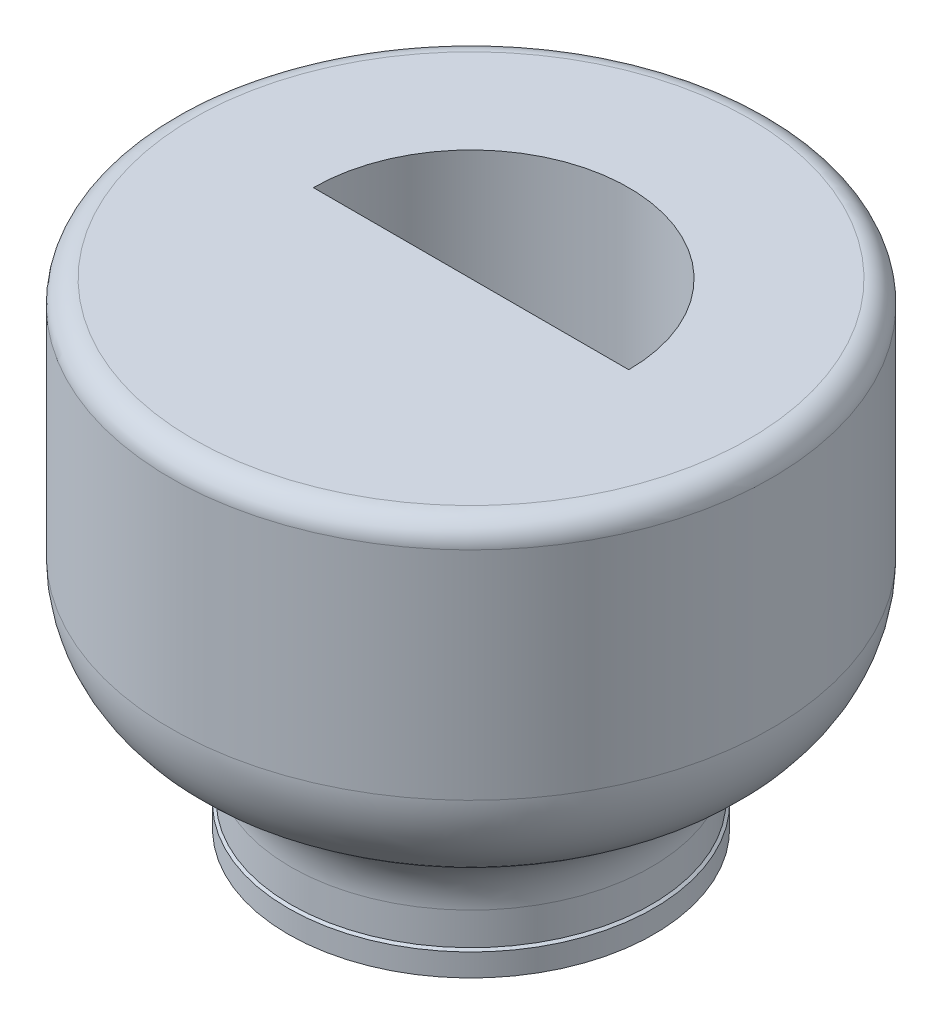
ISO-10303-21;
HEADER;
FILE_DESCRIPTION(('STEP AP214'),'2;1');
FILE_NAME('part.step','',(''),(''),'','','');
FILE_SCHEMA(('AUTOMOTIVE_DESIGN { 1 0 10303 214 1 1 1 1 }'));
ENDSEC;
DATA;
#1=APPLICATION_CONTEXT('core data for automotive mechanical design processes');
#2=APPLICATION_PROTOCOL_DEFINITION('international standard','automotive_design',2000,#1);
#3=PRODUCT_CONTEXT('',#1,'mechanical');
#4=PRODUCT('Part','Part','',(#3));
#5=PRODUCT_RELATED_PRODUCT_CATEGORY('part','',(#4));
#6=PRODUCT_DEFINITION_FORMATION('','',#4);
#7=PRODUCT_DEFINITION_CONTEXT('part definition',#1,'design');
#8=PRODUCT_DEFINITION('design','',#6,#7);
#9=PRODUCT_DEFINITION_SHAPE('','',#8);
#10=(LENGTH_UNIT() NAMED_UNIT(*) SI_UNIT(.MILLI.,.METRE.));
#11=(NAMED_UNIT(*) PLANE_ANGLE_UNIT() SI_UNIT($,.RADIAN.));
#12=(NAMED_UNIT(*) SI_UNIT($,.STERADIAN.) SOLID_ANGLE_UNIT());
#13=UNCERTAINTY_MEASURE_WITH_UNIT(LENGTH_MEASURE(1.E-05),#10,'distance_accuracy_value','');
#14=(GEOMETRIC_REPRESENTATION_CONTEXT(3) GLOBAL_UNCERTAINTY_ASSIGNED_CONTEXT((#13)) GLOBAL_UNIT_ASSIGNED_CONTEXT((#10,
#11,#12)) REPRESENTATION_CONTEXT('',''));
#15=CARTESIAN_POINT('',(0.,0.,0.));
#16=DIRECTION('',(0.,0.,1.));
#17=DIRECTION('',(1.,0.,0.));
#18=AXIS2_PLACEMENT_3D('',#15,#16,#17);
#19=CARTESIAN_POINT('',(0.,0.,0.));
#20=DIRECTION('',(0.,-1.,0.));
#21=DIRECTION('',(0.,0.,-1.));
#22=AXIS2_PLACEMENT_3D('',#19,#20,#21);
#23=CYLINDRICAL_SURFACE('',#22,22.5);
#24=CARTESIAN_POINT('',(0.,0.,0.));
#25=DIRECTION('',(0.,-1.,0.));
#26=DIRECTION('',(0.,0.,-1.));
#27=AXIS2_PLACEMENT_3D('',#24,#25,#26);
#28=CIRCLE('',#27,22.5);
#29=CARTESIAN_POINT('',(0.,0.,-22.5));
#30=VERTEX_POINT('',#29);
#31=EDGE_CURVE('E64',#30,#30,#28,.T.);
#32=ORIENTED_EDGE('',*,*,#31,.T.);
#33=EDGE_LOOP('',(#32));
#34=FACE_BOUND('',#33,.T.);
#35=CARTESIAN_POINT('',(0.,12.5,0.));
#36=DIRECTION('',(0.,-1.,0.));
#37=DIRECTION('',(0.,0.,-1.));
#38=AXIS2_PLACEMENT_3D('',#35,#36,#37);
#39=CIRCLE('',#38,22.5);
#40=CARTESIAN_POINT('',(0.,12.5,-22.5));
#41=VERTEX_POINT('',#40);
#42=EDGE_CURVE('E109',#41,#41,#39,.T.);
#43=ORIENTED_EDGE('',*,*,#42,.F.);
#44=EDGE_LOOP('',(#43));
#45=FACE_BOUND('',#44,.T.);
#46=ADVANCED_FACE('F36',(#34,#45),#23,.F.);
#47=CARTESIAN_POINT('',(0.,12.5,0.));
#48=DIRECTION('',(0.,-1.,0.));
#49=DIRECTION('',(0.,0.,-1.));
#50=AXIS2_PLACEMENT_3D('',#47,#48,#49);
#51=TOROIDAL_SURFACE('',#50,22.,0.5);
#52=ORIENTED_EDGE('',*,*,#42,.T.);
#53=EDGE_LOOP('',(#52));
#54=FACE_BOUND('',#53,.T.);
#55=CARTESIAN_POINT('',(0.,13.,0.));
#56=DIRECTION('',(0.,-1.,0.));
#57=DIRECTION('',(0.,0.,-1.));
#58=AXIS2_PLACEMENT_3D('',#55,#56,#57);
#59=CIRCLE('',#58,22.);
#60=CARTESIAN_POINT('',(0.,13.,-22.));
#61=VERTEX_POINT('',#60);
#62=EDGE_CURVE('E106',#61,#61,#59,.T.);
#63=ORIENTED_EDGE('',*,*,#62,.F.);
#64=EDGE_LOOP('',(#63));
#65=FACE_BOUND('',#64,.T.);
#66=ADVANCED_FACE('F174',(#54,#65),#51,.F.);
#67=CARTESIAN_POINT('',(0.,13.,0.));
#68=DIRECTION('',(0.,-1.,0.));
#69=DIRECTION('',(0.,0.,-1.));
#70=AXIS2_PLACEMENT_3D('',#67,#68,#69);
#71=PLANE('',#70);
#72=CARTESIAN_POINT('',(0.,13.,0.));
#73=DIRECTION('',(0.,-1.,0.));
#74=DIRECTION('',(0.,0.,1.));
#75=AXIS2_PLACEMENT_3D('',#72,#73,#74);
#76=CIRCLE('',#75,21.);
#77=CARTESIAN_POINT('',(-21.,13.,0.));
#78=VERTEX_POINT('',#77);
#79=CARTESIAN_POINT('',(21.,13.,0.));
#80=VERTEX_POINT('',#79);
#81=EDGE_CURVE('E50',#78,#80,#76,.T.);
#82=ORIENTED_EDGE('',*,*,#81,.F.);
#83=DIRECTION('',(-1.,0.,0.));
#84=VECTOR('',#83,1.);
#85=CARTESIAN_POINT('',(21.,13.,0.));
#86=LINE('',#85,#84);
#87=EDGE_CURVE('E68',#80,#78,#86,.T.);
#88=ORIENTED_EDGE('',*,*,#87,.F.);
#89=EDGE_LOOP('',(#82,#88));
#90=FACE_BOUND('',#89,.T.);
#91=ORIENTED_EDGE('',*,*,#62,.T.);
#92=EDGE_LOOP('',(#91));
#93=FACE_BOUND('',#92,.T.);
#94=ADVANCED_FACE('F72',(#90,#93),#71,.T.);
#95=CARTESIAN_POINT('',(0.,63.4278760968653,0.));
#96=DIRECTION('',(0.,1.,0.));
#97=DIRECTION('',(0.,0.,1.));
#98=AXIS2_PLACEMENT_3D('',#95,#96,#97);
#99=PLANE('',#98);
#100=CARTESIAN_POINT('',(0.,63.4278760968653,0.));
#101=DIRECTION('',(0.,1.,0.));
#102=DIRECTION('',(0.,0.,1.));
#103=AXIS2_PLACEMENT_3D('',#100,#101,#102);
#104=CIRCLE('',#103,21.);
#105=CARTESIAN_POINT('',(21.,63.4278760968653,0.));
#106=VERTEX_POINT('',#105);
#107=CARTESIAN_POINT('',(-21.,63.4278760968653,0.));
#108=VERTEX_POINT('',#107);
#109=EDGE_CURVE('E11',#106,#108,#104,.T.);
#110=ORIENTED_EDGE('',*,*,#109,.F.);
#111=DIRECTION('',(1.,0.,0.));
#112=VECTOR('',#111,1.);
#113=CARTESIAN_POINT('',(0.,63.4278760968653,0.));
#114=LINE('',#113,#112);
#115=EDGE_CURVE('E43',#108,#106,#114,.T.);
#116=ORIENTED_EDGE('',*,*,#115,.F.);
#117=EDGE_LOOP('',(#110,#116));
#118=FACE_BOUND('',#117,.T.);
#119=CARTESIAN_POINT('',(0.,63.4278760968653,0.));
#120=DIRECTION('',(0.,-1.,0.));
#121=DIRECTION('',(0.,0.,-1.));
#122=AXIS2_PLACEMENT_3D('',#119,#120,#121);
#123=CIRCLE('',#122,37.);
#124=CARTESIAN_POINT('',(0.,63.4278760968653,-37.));
#125=VERTEX_POINT('',#124);
#126=EDGE_CURVE('E103',#125,#125,#123,.T.);
#127=ORIENTED_EDGE('',*,*,#126,.F.);
#128=EDGE_LOOP('',(#127));
#129=FACE_BOUND('',#128,.T.);
#130=ADVANCED_FACE('F112',(#118,#129),#99,.T.);
#131=CARTESIAN_POINT('',(0.,60.4278760968653,0.));
#132=DIRECTION('',(0.,-1.,0.));
#133=DIRECTION('',(0.,0.,-1.));
#134=AXIS2_PLACEMENT_3D('',#131,#132,#133);
#135=TOROIDAL_SURFACE('',#134,37.,3.);
#136=ORIENTED_EDGE('',*,*,#126,.T.);
#137=EDGE_LOOP('',(#136));
#138=FACE_BOUND('',#137,.T.);
#139=CARTESIAN_POINT('',(0.,60.4278760968653,0.));
#140=DIRECTION('',(0.,-1.,0.));
#141=DIRECTION('',(0.,0.,-1.));
#142=AXIS2_PLACEMENT_3D('',#139,#140,#141);
#143=CIRCLE('',#142,40.);
#144=CARTESIAN_POINT('',(0.,60.4278760968653,-40.));
#145=VERTEX_POINT('',#144);
#146=EDGE_CURVE('E100',#145,#145,#143,.T.);
#147=ORIENTED_EDGE('',*,*,#146,.F.);
#148=EDGE_LOOP('',(#147));
#149=FACE_BOUND('',#148,.T.);
#150=ADVANCED_FACE('F115',(#138,#149),#135,.T.);
#151=CARTESIAN_POINT('',(0.,0.,0.));
#152=DIRECTION('',(0.,-1.,0.));
#153=DIRECTION('',(0.,0.,-1.));
#154=AXIS2_PLACEMENT_3D('',#151,#152,#153);
#155=CYLINDRICAL_SURFACE('',#154,40.);
#156=ORIENTED_EDGE('',*,*,#146,.T.);
#157=EDGE_LOOP('',(#156));
#158=FACE_BOUND('',#157,.T.);
#159=CARTESIAN_POINT('',(0.,31.5562889655761,0.));
#160=DIRECTION('',(0.,-1.,0.));
#161=DIRECTION('',(0.,0.,-1.));
#162=AXIS2_PLACEMENT_3D('',#159,#160,#161);
#163=CIRCLE('',#162,40.);
#164=CARTESIAN_POINT('',(0.,31.5562889655761,-40.));
#165=VERTEX_POINT('',#164);
#166=EDGE_CURVE('E97',#165,#165,#163,.T.);
#167=ORIENTED_EDGE('',*,*,#166,.F.);
#168=EDGE_LOOP('',(#167));
#169=FACE_BOUND('',#168,.T.);
#170=ADVANCED_FACE('F121',(#158,#169),#155,.T.);
#171=CARTESIAN_POINT('',(0.,31.5562889655761,0.));
#172=DIRECTION('',(0.,-1.,0.));
#173=DIRECTION('',(0.,0.,-1.));
#174=AXIS2_PLACEMENT_3D('',#171,#172,#173);
#175=TOROIDAL_SURFACE('',#174,25.,15.);
#176=ORIENTED_EDGE('',*,*,#166,.T.);
#177=EDGE_LOOP('',(#176));
#178=FACE_BOUND('',#177,.T.);
#179=CARTESIAN_POINT('',(0.,18.9896485668923,0.));
#180=DIRECTION('',(0.,-1.,0.));
#181=DIRECTION('',(0.,0.,-1.));
#182=AXIS2_PLACEMENT_3D('',#179,#180,#181);
#183=CIRCLE('',#182,33.1902105644586);
#184=CARTESIAN_POINT('',(0.,18.9896485668923,-33.1902105644586));
#185=VERTEX_POINT('',#184);
#186=EDGE_CURVE('E94',#185,#185,#183,.T.);
#187=ORIENTED_EDGE('',*,*,#186,.F.);
#188=EDGE_LOOP('',(#187));
#189=FACE_BOUND('',#188,.T.);
#190=ADVANCED_FACE('F127',(#178,#189),#175,.T.);
#191=CARTESIAN_POINT('',(0.,15.9588183533154,0.));
#192=DIRECTION('',(0.,1.,0.));
#193=DIRECTION('',(0.,0.,1.));
#194=AXIS2_PLACEMENT_3D('',#191,#192,#193);
#195=CONICAL_SURFACE('',#194,28.5398596236943,0.993197296529964);
#196=ORIENTED_EDGE('',*,*,#186,.T.);
#197=EDGE_LOOP('',(#196));
#198=FACE_BOUND('',#197,.T.);
#199=CARTESIAN_POINT('',(0.,15.9588183533154,0.));
#200=DIRECTION('',(0.,-1.,0.));
#201=DIRECTION('',(0.,0.,-1.));
#202=AXIS2_PLACEMENT_3D('',#199,#200,#201);
#203=CIRCLE('',#202,28.5398596236943);
#204=CARTESIAN_POINT('',(0.,15.9588183533154,-28.5398596236943));
#205=VERTEX_POINT('',#204);
#206=EDGE_CURVE('E91',#205,#205,#203,.T.);
#207=ORIENTED_EDGE('',*,*,#206,.F.);
#208=EDGE_LOOP('',(#207));
#209=FACE_BOUND('',#208,.T.);
#210=ADVANCED_FACE('F133',(#198,#209),#195,.T.);
#211=CARTESIAN_POINT('',(0.,7.58105808752617,0.));
#212=DIRECTION('',(0.,-1.,0.));
#213=DIRECTION('',(0.,0.,-1.));
#214=AXIS2_PLACEMENT_3D('',#211,#212,#213);
#215=TOROIDAL_SURFACE('',#214,34.,10.);
#216=ORIENTED_EDGE('',*,*,#206,.T.);
#217=EDGE_LOOP('',(#216));
#218=FACE_BOUND('',#217,.T.);
#219=CARTESIAN_POINT('',(0.,7.58105808752612,0.));
#220=DIRECTION('',(0.,-1.,0.));
#221=DIRECTION('',(0.,0.,-1.));
#222=AXIS2_PLACEMENT_3D('',#219,#220,#221);
#223=CIRCLE('',#222,24.);
#224=CARTESIAN_POINT('',(0.,7.58105808752612,-24.));
#225=VERTEX_POINT('',#224);
#226=EDGE_CURVE('E88',#225,#225,#223,.T.);
#227=ORIENTED_EDGE('',*,*,#226,.F.);
#228=EDGE_LOOP('',(#227));
#229=FACE_BOUND('',#228,.T.);
#230=ADVANCED_FACE('F139',(#218,#229),#215,.F.);
#231=CARTESIAN_POINT('',(0.,0.,0.));
#232=DIRECTION('',(0.,-1.,0.));
#233=DIRECTION('',(0.,0.,-1.));
#234=AXIS2_PLACEMENT_3D('',#231,#232,#233);
#235=CYLINDRICAL_SURFACE('',#234,24.);
#236=ORIENTED_EDGE('',*,*,#226,.T.);
#237=EDGE_LOOP('',(#236));
#238=FACE_BOUND('',#237,.T.);
#239=CARTESIAN_POINT('',(0.,3.25,0.));
#240=DIRECTION('',(0.,-1.,0.));
#241=DIRECTION('',(0.,0.,-1.));
#242=AXIS2_PLACEMENT_3D('',#239,#240,#241);
#243=CIRCLE('',#242,24.);
#244=CARTESIAN_POINT('',(0.,3.25,-24.));
#245=VERTEX_POINT('',#244);
#246=EDGE_CURVE('E85',#245,#245,#243,.T.);
#247=ORIENTED_EDGE('',*,*,#246,.F.);
#248=EDGE_LOOP('',(#247));
#249=FACE_BOUND('',#248,.T.);
#250=ADVANCED_FACE('F145',(#238,#249),#235,.T.);
#251=CARTESIAN_POINT('',(0.,3.,0.));
#252=DIRECTION('',(0.,-1.,0.));
#253=DIRECTION('',(0.,0.,-1.));
#254=AXIS2_PLACEMENT_3D('',#251,#252,#253);
#255=CONICAL_SURFACE('',#254,24.35,0.950546840812071);
#256=ORIENTED_EDGE('',*,*,#246,.T.);
#257=EDGE_LOOP('',(#256));
#258=FACE_BOUND('',#257,.T.);
#259=CARTESIAN_POINT('',(0.,3.,0.));
#260=DIRECTION('',(0.,-1.,0.));
#261=DIRECTION('',(0.,0.,-1.));
#262=AXIS2_PLACEMENT_3D('',#259,#260,#261);
#263=CIRCLE('',#262,24.35);
#264=CARTESIAN_POINT('',(0.,3.,-24.35));
#265=VERTEX_POINT('',#264);
#266=EDGE_CURVE('E82',#265,#265,#263,.T.);
#267=ORIENTED_EDGE('',*,*,#266,.F.);
#268=EDGE_LOOP('',(#267));
#269=FACE_BOUND('',#268,.T.);
#270=ADVANCED_FACE('F151',(#258,#269),#255,.T.);
#271=CARTESIAN_POINT('',(0.,0.,0.));
#272=DIRECTION('',(0.,-1.,0.));
#273=DIRECTION('',(0.,0.,-1.));
#274=AXIS2_PLACEMENT_3D('',#271,#272,#273);
#275=CYLINDRICAL_SURFACE('',#274,24.35);
#276=ORIENTED_EDGE('',*,*,#266,.T.);
#277=EDGE_LOOP('',(#276));
#278=FACE_BOUND('',#277,.T.);
#279=CARTESIAN_POINT('',(0.,0.,0.));
#280=DIRECTION('',(0.,-1.,0.));
#281=DIRECTION('',(0.,0.,-1.));
#282=AXIS2_PLACEMENT_3D('',#279,#280,#281);
#283=CIRCLE('',#282,24.35);
#284=CARTESIAN_POINT('',(0.,0.,-24.35));
#285=VERTEX_POINT('',#284);
#286=EDGE_CURVE('E79',#285,#285,#283,.T.);
#287=ORIENTED_EDGE('',*,*,#286,.F.);
#288=EDGE_LOOP('',(#287));
#289=FACE_BOUND('',#288,.T.);
#290=ADVANCED_FACE('F157',(#278,#289),#275,.T.);
#291=CARTESIAN_POINT('',(22.5,0.,0.));
#292=DIRECTION('',(0.,-1.,0.));
#293=DIRECTION('',(0.,0.,-1.));
#294=AXIS2_PLACEMENT_3D('',#291,#292,#293);
#295=PLANE('',#294);
#296=ORIENTED_EDGE('',*,*,#286,.T.);
#297=EDGE_LOOP('',(#296));
#298=FACE_BOUND('',#297,.T.);
#299=ORIENTED_EDGE('',*,*,#31,.F.);
#300=EDGE_LOOP('',(#299));
#301=FACE_BOUND('',#300,.T.);
#302=ADVANCED_FACE('F163',(#298,#301),#295,.T.);
#303=CARTESIAN_POINT('',(0.,73.,0.));
#304=DIRECTION('',(0.,-1.,0.));
#305=DIRECTION('',(0.,0.,-1.));
#306=AXIS2_PLACEMENT_3D('',#303,#304,#305);
#307=CYLINDRICAL_SURFACE('',#306,21.);
#308=ORIENTED_EDGE('',*,*,#109,.T.);
#309=DIRECTION('',(0.,-1.,0.));
#310=VECTOR('',#309,1.);
#311=CARTESIAN_POINT('',(-21.,73.,0.));
#312=LINE('',#311,#310);
#313=EDGE_CURVE('E57',#108,#78,#312,.T.);
#314=ORIENTED_EDGE('',*,*,#313,.T.);
#315=ORIENTED_EDGE('',*,*,#81,.T.);
#316=DIRECTION('',(0.,-1.,0.));
#317=VECTOR('',#316,1.);
#318=CARTESIAN_POINT('',(21.,73.,0.));
#319=LINE('',#318,#317);
#320=EDGE_CURVE('E65',#106,#80,#319,.T.);
#321=ORIENTED_EDGE('',*,*,#320,.F.);
#322=EDGE_LOOP('',(#308,#314,#315,#321));
#323=FACE_BOUND('',#322,.T.);
#324=ADVANCED_FACE('F61',(#323),#307,.F.);
#325=CARTESIAN_POINT('',(21.,73.,0.));
#326=DIRECTION('',(0.,0.,1.));
#327=DIRECTION('',(1.,0.,0.));
#328=AXIS2_PLACEMENT_3D('',#325,#326,#327);
#329=PLANE('',#328);
#330=ORIENTED_EDGE('',*,*,#115,.T.);
#331=ORIENTED_EDGE('',*,*,#320,.T.);
#332=ORIENTED_EDGE('',*,*,#87,.T.);
#333=ORIENTED_EDGE('',*,*,#313,.F.);
#334=EDGE_LOOP('',(#330,#331,#332,#333));
#335=FACE_BOUND('',#334,.T.);
#336=ADVANCED_FACE('F69',(#335),#329,.F.);
#337=CLOSED_SHELL('',(#46,#66,#94,#130,#150,#170,#190,#210,#230,#250,#270,#290,#302,#324,#336));
#338=MANIFOLD_SOLID_BREP('B2',#337);
#339=ADVANCED_BREP_SHAPE_REPRESENTATION('',(#18,#338),#14);
#340=SHAPE_DEFINITION_REPRESENTATION(#9,#339);
ENDSEC;
END-ISO-10303-21;
